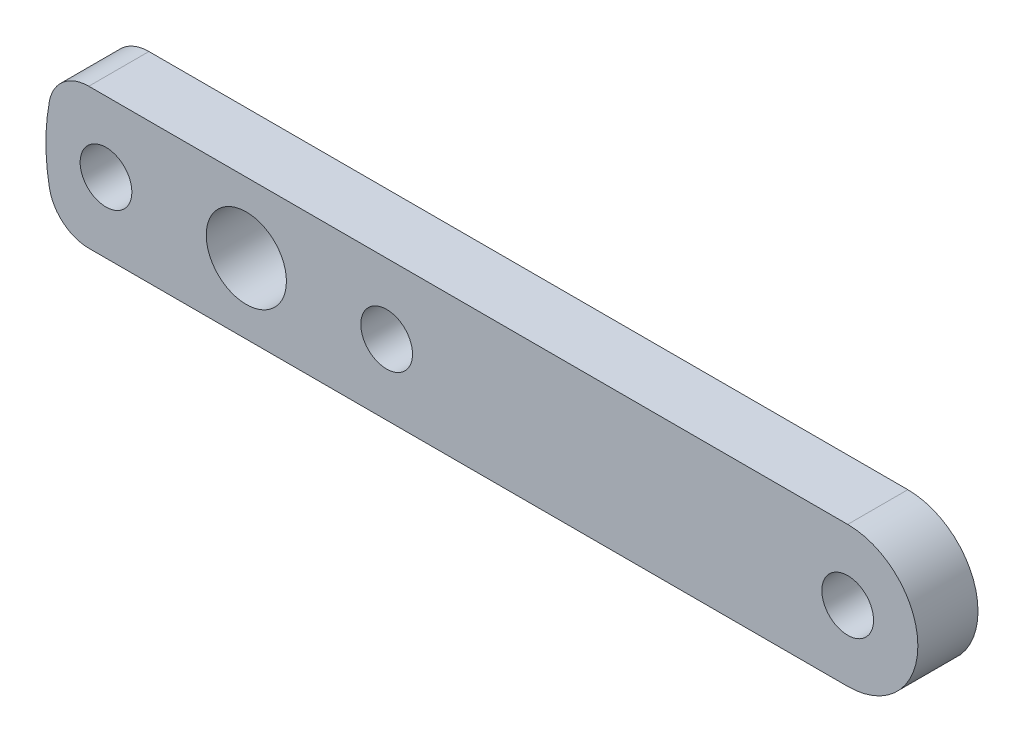
ISO-10303-21;
HEADER;
FILE_DESCRIPTION(('STEP AP214'),'2;1');
FILE_NAME('part.step','',(''),(''),'','','');
FILE_SCHEMA(('AUTOMOTIVE_DESIGN { 1 0 10303 214 1 1 1 1 }'));
ENDSEC;
DATA;
#1=APPLICATION_CONTEXT('core data for automotive mechanical design processes');
#2=APPLICATION_PROTOCOL_DEFINITION('international standard','automotive_design',2000,#1);
#3=PRODUCT_CONTEXT('',#1,'mechanical');
#4=PRODUCT('Part','Part','',(#3));
#5=PRODUCT_RELATED_PRODUCT_CATEGORY('part','',(#4));
#6=PRODUCT_DEFINITION_FORMATION('','',#4);
#7=PRODUCT_DEFINITION_CONTEXT('part definition',#1,'design');
#8=PRODUCT_DEFINITION('design','',#6,#7);
#9=PRODUCT_DEFINITION_SHAPE('','',#8);
#10=(LENGTH_UNIT() NAMED_UNIT(*) SI_UNIT(.MILLI.,.METRE.));
#11=(NAMED_UNIT(*) PLANE_ANGLE_UNIT() SI_UNIT($,.RADIAN.));
#12=(NAMED_UNIT(*) SI_UNIT($,.STERADIAN.) SOLID_ANGLE_UNIT());
#13=UNCERTAINTY_MEASURE_WITH_UNIT(LENGTH_MEASURE(1.E-05),#10,'distance_accuracy_value','');
#14=(GEOMETRIC_REPRESENTATION_CONTEXT(3) GLOBAL_UNCERTAINTY_ASSIGNED_CONTEXT((#13)) GLOBAL_UNIT_ASSIGNED_CONTEXT((#10,
#11,#12)) REPRESENTATION_CONTEXT('',''));
#15=CARTESIAN_POINT('',(0.,0.,0.));
#16=DIRECTION('',(0.,0.,1.));
#17=DIRECTION('',(1.,0.,0.));
#18=AXIS2_PLACEMENT_3D('',#15,#16,#17);
#19=CARTESIAN_POINT('',(0.,0.,1.5));
#20=DIRECTION('',(0.,0.,-1.));
#21=DIRECTION('',(-1.,0.,0.));
#22=AXIS2_PLACEMENT_3D('',#19,#20,#21);
#23=PLANE('',#22);
#24=CARTESIAN_POINT('',(0.,0.,1.5));
#25=DIRECTION('',(0.,0.,1.));
#26=DIRECTION('',(-1.,0.,0.));
#27=AXIS2_PLACEMENT_3D('',#24,#25,#26);
#28=CIRCLE('',#27,10.);
#29=CARTESIAN_POINT('',(-9.82264602843857,1.875,1.5));
#30=VERTEX_POINT('',#29);
#31=CARTESIAN_POINT('',(-9.82264602843857,-1.875,1.5));
#32=VERTEX_POINT('',#31);
#33=EDGE_CURVE('E108',#30,#32,#28,.T.);
#34=ORIENTED_EDGE('',*,*,#33,.T.);
#35=CARTESIAN_POINT('',(-7.85811682275086,-1.5,1.5));
#36=DIRECTION('',(0.,0.,-1.));
#37=DIRECTION('',(-1.,0.,0.));
#38=AXIS2_PLACEMENT_3D('',#35,#36,#37);
#39=CIRCLE('',#38,2.);
#40=CARTESIAN_POINT('',(-7.85811682275085,-3.5,1.5));
#41=VERTEX_POINT('',#40);
#42=EDGE_CURVE('E51',#32,#41,#39,.F.);
#43=ORIENTED_EDGE('',*,*,#42,.T.);
#44=DIRECTION('',(1.,0.,0.));
#45=VECTOR('',#44,1.);
#46=CARTESIAN_POINT('',(30.,-3.49999999999999,1.5));
#47=LINE('',#46,#45);
#48=CARTESIAN_POINT('',(30.,-3.49999999999999,1.5));
#49=VERTEX_POINT('',#48);
#50=EDGE_CURVE('E97',#41,#49,#47,.T.);
#51=ORIENTED_EDGE('',*,*,#50,.T.);
#52=CARTESIAN_POINT('',(30.,0.,1.5));
#53=DIRECTION('',(0.,0.,1.));
#54=DIRECTION('',(-1.,0.,0.));
#55=AXIS2_PLACEMENT_3D('',#52,#53,#54);
#56=CIRCLE('',#55,3.49999999999999);
#57=CARTESIAN_POINT('',(30.,3.5,1.5));
#58=VERTEX_POINT('',#57);
#59=EDGE_CURVE('E101',#49,#58,#56,.T.);
#60=ORIENTED_EDGE('',*,*,#59,.T.);
#61=DIRECTION('',(-1.,0.,0.));
#62=VECTOR('',#61,1.);
#63=CARTESIAN_POINT('',(-9.3674969975976,3.5,1.5));
#64=LINE('',#63,#62);
#65=CARTESIAN_POINT('',(-7.85811682275086,3.5,1.5));
#66=VERTEX_POINT('',#65);
#67=EDGE_CURVE('E124',#58,#66,#64,.T.);
#68=ORIENTED_EDGE('',*,*,#67,.T.);
#69=CARTESIAN_POINT('',(-7.85811682275086,1.5,1.5));
#70=DIRECTION('',(0.,0.,-1.));
#71=DIRECTION('',(-1.,0.,0.));
#72=AXIS2_PLACEMENT_3D('',#69,#70,#71);
#73=CIRCLE('',#72,2.);
#74=EDGE_CURVE('E158',#66,#30,#73,.F.);
#75=ORIENTED_EDGE('',*,*,#74,.T.);
#76=EDGE_LOOP('',(#34,#43,#51,#60,#68,#75));
#77=FACE_BOUND('',#76,.T.);
#78=CARTESIAN_POINT('',(-7.,0.,1.5));
#79=DIRECTION('',(0.,0.,1.));
#80=DIRECTION('',(1.,0.,0.));
#81=AXIS2_PLACEMENT_3D('',#78,#79,#80);
#82=CIRCLE('',#81,1.29);
#83=CARTESIAN_POINT('',(-5.71,0.,1.5));
#84=VERTEX_POINT('',#83);
#85=EDGE_CURVE('E133',#84,#84,#82,.T.);
#86=ORIENTED_EDGE('',*,*,#85,.F.);
#87=EDGE_LOOP('',(#86));
#88=FACE_BOUND('',#87,.T.);
#89=CARTESIAN_POINT('',(7.,0.,1.5));
#90=DIRECTION('',(0.,0.,1.));
#91=DIRECTION('',(1.,0.,0.));
#92=AXIS2_PLACEMENT_3D('',#89,#90,#91);
#93=CIRCLE('',#92,1.29);
#94=CARTESIAN_POINT('',(8.29,0.,1.5));
#95=VERTEX_POINT('',#94);
#96=EDGE_CURVE('E228',#95,#95,#93,.T.);
#97=ORIENTED_EDGE('',*,*,#96,.F.);
#98=EDGE_LOOP('',(#97));
#99=FACE_BOUND('',#98,.T.);
#100=CARTESIAN_POINT('',(0.,0.,1.5));
#101=DIRECTION('',(0.,0.,1.));
#102=DIRECTION('',(1.,0.,0.));
#103=AXIS2_PLACEMENT_3D('',#100,#101,#102);
#104=CIRCLE('',#103,2.);
#105=CARTESIAN_POINT('',(2.,0.,1.5));
#106=VERTEX_POINT('',#105);
#107=EDGE_CURVE('E220',#106,#106,#104,.T.);
#108=ORIENTED_EDGE('',*,*,#107,.F.);
#109=EDGE_LOOP('',(#108));
#110=FACE_BOUND('',#109,.T.);
#111=CARTESIAN_POINT('',(30.,0.,1.5));
#112=DIRECTION('',(0.,0.,1.));
#113=DIRECTION('',(1.,0.,0.));
#114=AXIS2_PLACEMENT_3D('',#111,#112,#113);
#115=CIRCLE('',#114,1.29);
#116=CARTESIAN_POINT('',(31.29,0.,1.5));
#117=VERTEX_POINT('',#116);
#118=EDGE_CURVE('E209',#117,#117,#115,.T.);
#119=ORIENTED_EDGE('',*,*,#118,.F.);
#120=EDGE_LOOP('',(#119));
#121=FACE_BOUND('',#120,.T.);
#122=ADVANCED_FACE('F42',(#77,#88,#99,#110,#121),#23,.F.);
#123=CARTESIAN_POINT('',(0.,0.,-1.5));
#124=DIRECTION('',(0.,0.,-1.));
#125=DIRECTION('',(-1.,0.,0.));
#126=AXIS2_PLACEMENT_3D('',#123,#124,#125);
#127=PLANE('',#126);
#128=CARTESIAN_POINT('',(0.,0.,-1.5));
#129=DIRECTION('',(0.,0.,1.));
#130=DIRECTION('',(1.,0.,0.));
#131=AXIS2_PLACEMENT_3D('',#128,#129,#130);
#132=CIRCLE('',#131,2.);
#133=CARTESIAN_POINT('',(2.,0.,-1.5));
#134=VERTEX_POINT('',#133);
#135=EDGE_CURVE('E217',#134,#134,#132,.T.);
#136=ORIENTED_EDGE('',*,*,#135,.T.);
#137=EDGE_LOOP('',(#136));
#138=FACE_BOUND('',#137,.T.);
#139=CARTESIAN_POINT('',(-7.,0.,-1.5));
#140=DIRECTION('',(0.,0.,1.));
#141=DIRECTION('',(1.,0.,0.));
#142=AXIS2_PLACEMENT_3D('',#139,#140,#141);
#143=CIRCLE('',#142,1.29);
#144=CARTESIAN_POINT('',(-5.71,0.,-1.5));
#145=VERTEX_POINT('',#144);
#146=EDGE_CURVE('E232',#145,#145,#143,.T.);
#147=ORIENTED_EDGE('',*,*,#146,.T.);
#148=EDGE_LOOP('',(#147));
#149=FACE_BOUND('',#148,.T.);
#150=DIRECTION('',(1.,0.,0.));
#151=VECTOR('',#150,1.);
#152=CARTESIAN_POINT('',(30.,-3.49999999999999,-1.5));
#153=LINE('',#152,#151);
#154=CARTESIAN_POINT('',(-7.85811682275085,-3.5,-1.5));
#155=VERTEX_POINT('',#154);
#156=CARTESIAN_POINT('',(30.,-3.49999999999999,-1.5));
#157=VERTEX_POINT('',#156);
#158=EDGE_CURVE('E114',#155,#157,#153,.T.);
#159=ORIENTED_EDGE('',*,*,#158,.F.);
#160=CARTESIAN_POINT('',(-7.85811682275086,-1.5,-1.5));
#161=DIRECTION('',(0.,0.,-1.));
#162=DIRECTION('',(-1.,0.,0.));
#163=AXIS2_PLACEMENT_3D('',#160,#161,#162);
#164=CIRCLE('',#163,2.);
#165=CARTESIAN_POINT('',(-9.82264602843857,-1.875,-1.5));
#166=VERTEX_POINT('',#165);
#167=EDGE_CURVE('E149',#155,#166,#164,.T.);
#168=ORIENTED_EDGE('',*,*,#167,.T.);
#169=CARTESIAN_POINT('',(0.,0.,-1.5));
#170=DIRECTION('',(0.,0.,1.));
#171=DIRECTION('',(-1.,0.,0.));
#172=AXIS2_PLACEMENT_3D('',#169,#170,#171);
#173=CIRCLE('',#172,10.);
#174=CARTESIAN_POINT('',(-9.82264602843857,1.875,-1.5));
#175=VERTEX_POINT('',#174);
#176=EDGE_CURVE('E130',#175,#166,#173,.T.);
#177=ORIENTED_EDGE('',*,*,#176,.F.);
#178=CARTESIAN_POINT('',(-7.85811682275086,1.5,-1.5));
#179=DIRECTION('',(0.,0.,-1.));
#180=DIRECTION('',(-1.,0.,0.));
#181=AXIS2_PLACEMENT_3D('',#178,#179,#180);
#182=CIRCLE('',#181,2.);
#183=CARTESIAN_POINT('',(-7.85811682275086,3.5,-1.5));
#184=VERTEX_POINT('',#183);
#185=EDGE_CURVE('E146',#175,#184,#182,.T.);
#186=ORIENTED_EDGE('',*,*,#185,.T.);
#187=DIRECTION('',(-1.,0.,0.));
#188=VECTOR('',#187,1.);
#189=CARTESIAN_POINT('',(-9.3674969975976,3.5,-1.5));
#190=LINE('',#189,#188);
#191=CARTESIAN_POINT('',(30.,3.5,-1.5));
#192=VERTEX_POINT('',#191);
#193=EDGE_CURVE('E139',#192,#184,#190,.T.);
#194=ORIENTED_EDGE('',*,*,#193,.F.);
#195=CARTESIAN_POINT('',(30.,0.,-1.5));
#196=DIRECTION('',(0.,0.,1.));
#197=DIRECTION('',(-1.,0.,0.));
#198=AXIS2_PLACEMENT_3D('',#195,#196,#197);
#199=CIRCLE('',#198,3.49999999999999);
#200=EDGE_CURVE('E136',#157,#192,#199,.T.);
#201=ORIENTED_EDGE('',*,*,#200,.F.);
#202=EDGE_LOOP('',(#159,#168,#177,#186,#194,#201));
#203=FACE_BOUND('',#202,.T.);
#204=CARTESIAN_POINT('',(7.,0.,-1.5));
#205=DIRECTION('',(0.,0.,1.));
#206=DIRECTION('',(1.,0.,0.));
#207=AXIS2_PLACEMENT_3D('',#204,#205,#206);
#208=CIRCLE('',#207,1.29);
#209=CARTESIAN_POINT('',(8.29,0.,-1.5));
#210=VERTEX_POINT('',#209);
#211=EDGE_CURVE('E224',#210,#210,#208,.T.);
#212=ORIENTED_EDGE('',*,*,#211,.T.);
#213=EDGE_LOOP('',(#212));
#214=FACE_BOUND('',#213,.T.);
#215=CARTESIAN_POINT('',(30.,0.,-1.5));
#216=DIRECTION('',(0.,0.,1.));
#217=DIRECTION('',(1.,0.,0.));
#218=AXIS2_PLACEMENT_3D('',#215,#216,#217);
#219=CIRCLE('',#218,1.29);
#220=CARTESIAN_POINT('',(31.29,0.,-1.5));
#221=VERTEX_POINT('',#220);
#222=EDGE_CURVE('E212',#221,#221,#219,.T.);
#223=ORIENTED_EDGE('',*,*,#222,.T.);
#224=EDGE_LOOP('',(#223));
#225=FACE_BOUND('',#224,.T.);
#226=ADVANCED_FACE('F169',(#138,#149,#203,#214,#225),#127,.T.);
#227=CARTESIAN_POINT('',(0.,0.,1.5));
#228=DIRECTION('',(0.,0.,-1.));
#229=DIRECTION('',(-1.,0.,0.));
#230=AXIS2_PLACEMENT_3D('',#227,#228,#229);
#231=CYLINDRICAL_SURFACE('',#230,10.);
#232=ORIENTED_EDGE('',*,*,#176,.T.);
#233=DIRECTION('',(0.,0.,-1.));
#234=VECTOR('',#233,1.);
#235=CARTESIAN_POINT('',(-9.82264602843857,-1.875,1.5));
#236=LINE('',#235,#234);
#237=EDGE_CURVE('E64',#166,#32,#236,.F.);
#238=ORIENTED_EDGE('',*,*,#237,.T.);
#239=ORIENTED_EDGE('',*,*,#33,.F.);
#240=DIRECTION('',(0.,0.,-1.));
#241=VECTOR('',#240,1.);
#242=CARTESIAN_POINT('',(-9.82264602843857,1.875,1.5));
#243=LINE('',#242,#241);
#244=EDGE_CURVE('E152',#30,#175,#243,.T.);
#245=ORIENTED_EDGE('',*,*,#244,.T.);
#246=EDGE_LOOP('',(#232,#238,#239,#245));
#247=FACE_BOUND('',#246,.T.);
#248=ADVANCED_FACE('F164',(#247),#231,.T.);
#249=CARTESIAN_POINT('',(30.,-3.49999999999999,1.5));
#250=DIRECTION('',(0.,1.,0.));
#251=DIRECTION('',(-1.,0.,0.));
#252=AXIS2_PLACEMENT_3D('',#249,#250,#251);
#253=PLANE('',#252);
#254=ORIENTED_EDGE('',*,*,#50,.F.);
#255=DIRECTION('',(0.,0.,-1.));
#256=VECTOR('',#255,1.);
#257=CARTESIAN_POINT('',(-7.85811682275085,-3.5,1.5));
#258=LINE('',#257,#256);
#259=EDGE_CURVE('E118',#41,#155,#258,.T.);
#260=ORIENTED_EDGE('',*,*,#259,.T.);
#261=ORIENTED_EDGE('',*,*,#158,.T.);
#262=DIRECTION('',(0.,0.,-1.));
#263=VECTOR('',#262,1.);
#264=CARTESIAN_POINT('',(30.,-3.49999999999999,1.5));
#265=LINE('',#264,#263);
#266=EDGE_CURVE('E111',#49,#157,#265,.T.);
#267=ORIENTED_EDGE('',*,*,#266,.F.);
#268=EDGE_LOOP('',(#254,#260,#261,#267));
#269=FACE_BOUND('',#268,.T.);
#270=ADVANCED_FACE('F112',(#269),#253,.F.);
#271=CARTESIAN_POINT('',(30.,0.,1.5));
#272=DIRECTION('',(0.,0.,-1.));
#273=DIRECTION('',(-1.,0.,0.));
#274=AXIS2_PLACEMENT_3D('',#271,#272,#273);
#275=CYLINDRICAL_SURFACE('',#274,3.49999999999999);
#276=ORIENTED_EDGE('',*,*,#200,.T.);
#277=DIRECTION('',(0.,0.,-1.));
#278=VECTOR('',#277,1.);
#279=CARTESIAN_POINT('',(30.,3.5,1.5));
#280=LINE('',#279,#278);
#281=EDGE_CURVE('E119',#58,#192,#280,.T.);
#282=ORIENTED_EDGE('',*,*,#281,.F.);
#283=ORIENTED_EDGE('',*,*,#59,.F.);
#284=ORIENTED_EDGE('',*,*,#266,.T.);
#285=EDGE_LOOP('',(#276,#282,#283,#284));
#286=FACE_BOUND('',#285,.T.);
#287=ADVANCED_FACE('F121',(#286),#275,.T.);
#288=CARTESIAN_POINT('',(-9.3674969975976,3.5,1.5));
#289=DIRECTION('',(0.,-1.,0.));
#290=DIRECTION('',(1.,0.,0.));
#291=AXIS2_PLACEMENT_3D('',#288,#289,#290);
#292=PLANE('',#291);
#293=ORIENTED_EDGE('',*,*,#193,.T.);
#294=DIRECTION('',(0.,0.,-1.));
#295=VECTOR('',#294,1.);
#296=CARTESIAN_POINT('',(-7.85811682275086,3.5,1.5));
#297=LINE('',#296,#295);
#298=EDGE_CURVE('E11',#184,#66,#297,.F.);
#299=ORIENTED_EDGE('',*,*,#298,.T.);
#300=ORIENTED_EDGE('',*,*,#67,.F.);
#301=ORIENTED_EDGE('',*,*,#281,.T.);
#302=EDGE_LOOP('',(#293,#299,#300,#301));
#303=FACE_BOUND('',#302,.T.);
#304=ADVANCED_FACE('F171',(#303),#292,.F.);
#305=CARTESIAN_POINT('',(-7.,0.,1.5));
#306=DIRECTION('',(0.,0.,-1.));
#307=DIRECTION('',(-1.,0.,0.));
#308=AXIS2_PLACEMENT_3D('',#305,#306,#307);
#309=CYLINDRICAL_SURFACE('',#308,1.29);
#310=ORIENTED_EDGE('',*,*,#85,.T.);
#311=EDGE_LOOP('',(#310));
#312=FACE_BOUND('',#311,.T.);
#313=ORIENTED_EDGE('',*,*,#146,.F.);
#314=EDGE_LOOP('',(#313));
#315=FACE_BOUND('',#314,.T.);
#316=ADVANCED_FACE('F173',(#312,#315),#309,.F.);
#317=CARTESIAN_POINT('',(7.,0.,1.5));
#318=DIRECTION('',(0.,0.,-1.));
#319=DIRECTION('',(-1.,0.,0.));
#320=AXIS2_PLACEMENT_3D('',#317,#318,#319);
#321=CYLINDRICAL_SURFACE('',#320,1.29);
#322=ORIENTED_EDGE('',*,*,#96,.T.);
#323=EDGE_LOOP('',(#322));
#324=FACE_BOUND('',#323,.T.);
#325=ORIENTED_EDGE('',*,*,#211,.F.);
#326=EDGE_LOOP('',(#325));
#327=FACE_BOUND('',#326,.T.);
#328=ADVANCED_FACE('F179',(#324,#327),#321,.F.);
#329=CARTESIAN_POINT('',(0.,0.,1.5));
#330=DIRECTION('',(0.,0.,-1.));
#331=DIRECTION('',(-1.,0.,0.));
#332=AXIS2_PLACEMENT_3D('',#329,#330,#331);
#333=CYLINDRICAL_SURFACE('',#332,2.);
#334=ORIENTED_EDGE('',*,*,#107,.T.);
#335=EDGE_LOOP('',(#334));
#336=FACE_BOUND('',#335,.T.);
#337=ORIENTED_EDGE('',*,*,#135,.F.);
#338=EDGE_LOOP('',(#337));
#339=FACE_BOUND('',#338,.T.);
#340=ADVANCED_FACE('F193',(#336,#339),#333,.F.);
#341=CARTESIAN_POINT('',(30.,0.,1.5));
#342=DIRECTION('',(0.,0.,-1.));
#343=DIRECTION('',(-1.,0.,0.));
#344=AXIS2_PLACEMENT_3D('',#341,#342,#343);
#345=CYLINDRICAL_SURFACE('',#344,1.29);
#346=ORIENTED_EDGE('',*,*,#118,.T.);
#347=EDGE_LOOP('',(#346));
#348=FACE_BOUND('',#347,.T.);
#349=ORIENTED_EDGE('',*,*,#222,.F.);
#350=EDGE_LOOP('',(#349));
#351=FACE_BOUND('',#350,.T.);
#352=ADVANCED_FACE('F197',(#348,#351),#345,.F.);
#353=CARTESIAN_POINT('',(-7.85811682275086,-1.5,1.5));
#354=DIRECTION('',(0.,0.,-1.));
#355=DIRECTION('',(-1.,0.,0.));
#356=AXIS2_PLACEMENT_3D('',#353,#354,#355);
#357=CYLINDRICAL_SURFACE('',#356,2.);
#358=ORIENTED_EDGE('',*,*,#42,.F.);
#359=ORIENTED_EDGE('',*,*,#237,.F.);
#360=ORIENTED_EDGE('',*,*,#167,.F.);
#361=ORIENTED_EDGE('',*,*,#259,.F.);
#362=EDGE_LOOP('',(#358,#359,#360,#361));
#363=FACE_BOUND('',#362,.T.);
#364=ADVANCED_FACE('F200',(#363),#357,.T.);
#365=CARTESIAN_POINT('',(-7.85811682275086,1.5,1.5));
#366=DIRECTION('',(0.,0.,-1.));
#367=DIRECTION('',(-1.,0.,0.));
#368=AXIS2_PLACEMENT_3D('',#365,#366,#367);
#369=CYLINDRICAL_SURFACE('',#368,2.);
#370=ORIENTED_EDGE('',*,*,#74,.F.);
#371=ORIENTED_EDGE('',*,*,#298,.F.);
#372=ORIENTED_EDGE('',*,*,#185,.F.);
#373=ORIENTED_EDGE('',*,*,#244,.F.);
#374=EDGE_LOOP('',(#370,#371,#372,#373));
#375=FACE_BOUND('',#374,.T.);
#376=ADVANCED_FACE('F44',(#375),#369,.T.);
#377=CLOSED_SHELL('',(#122,#226,#248,#270,#287,#304,#316,#328,#340,#352,#364,#376));
#378=MANIFOLD_SOLID_BREP('B2',#377);
#379=ADVANCED_BREP_SHAPE_REPRESENTATION('',(#18,#378),#14);
#380=SHAPE_DEFINITION_REPRESENTATION(#9,#379);
ENDSEC;
END-ISO-10303-21;
